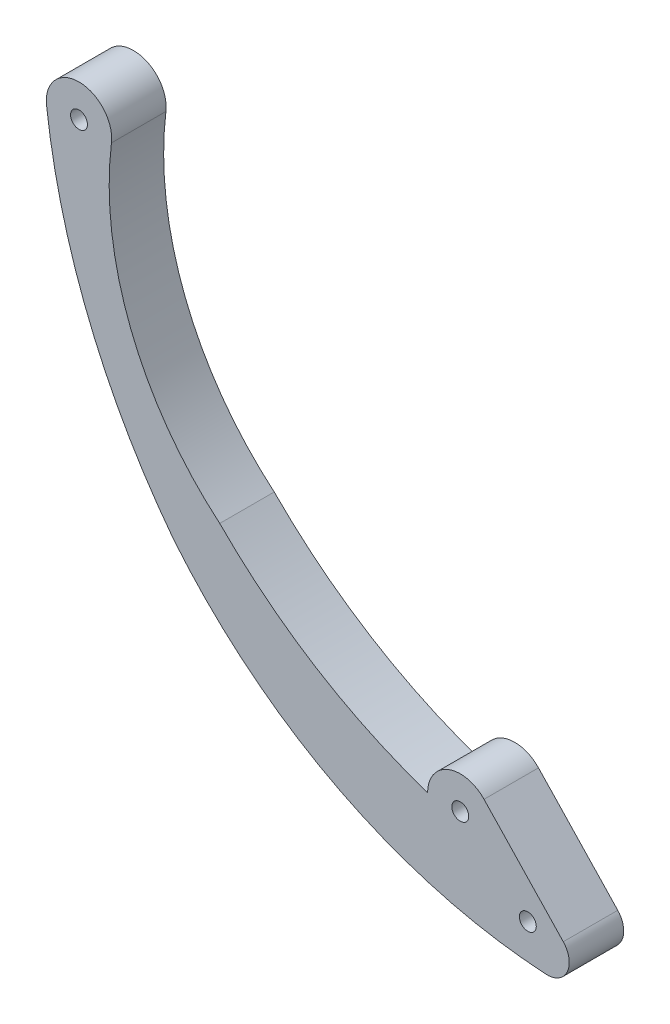
ISO-10303-21;
HEADER;
FILE_DESCRIPTION(('STEP AP214'),'2;1');
FILE_NAME('part.step','',(''),(''),'','','');
FILE_SCHEMA(('AUTOMOTIVE_DESIGN { 1 0 10303 214 1 1 1 1 }'));
ENDSEC;
DATA;
#1=APPLICATION_CONTEXT('core data for automotive mechanical design processes');
#2=APPLICATION_PROTOCOL_DEFINITION('international standard','automotive_design',2000,#1);
#3=PRODUCT_CONTEXT('',#1,'mechanical');
#4=PRODUCT('Part','Part','',(#3));
#5=PRODUCT_RELATED_PRODUCT_CATEGORY('part','',(#4));
#6=PRODUCT_DEFINITION_FORMATION('','',#4);
#7=PRODUCT_DEFINITION_CONTEXT('part definition',#1,'design');
#8=PRODUCT_DEFINITION('design','',#6,#7);
#9=PRODUCT_DEFINITION_SHAPE('','',#8);
#10=(LENGTH_UNIT() NAMED_UNIT(*) SI_UNIT(.MILLI.,.METRE.));
#11=(NAMED_UNIT(*) PLANE_ANGLE_UNIT() SI_UNIT($,.RADIAN.));
#12=(NAMED_UNIT(*) SI_UNIT($,.STERADIAN.) SOLID_ANGLE_UNIT());
#13=UNCERTAINTY_MEASURE_WITH_UNIT(LENGTH_MEASURE(1.E-05),#10,'distance_accuracy_value','');
#14=(GEOMETRIC_REPRESENTATION_CONTEXT(3) GLOBAL_UNCERTAINTY_ASSIGNED_CONTEXT((#13)) GLOBAL_UNIT_ASSIGNED_CONTEXT((#10,
#11,#12)) REPRESENTATION_CONTEXT('',''));
#15=CARTESIAN_POINT('',(0.,0.,0.));
#16=DIRECTION('',(0.,0.,1.));
#17=DIRECTION('',(1.,0.,0.));
#18=AXIS2_PLACEMENT_3D('',#15,#16,#17);
#19=CARTESIAN_POINT('',(0.,0.,5.));
#20=DIRECTION('',(0.,0.,1.));
#21=DIRECTION('',(1.,0.,0.));
#22=AXIS2_PLACEMENT_3D('',#19,#20,#21);
#23=PLANE('',#22);
#24=CARTESIAN_POINT('',(-16.,14.,5.));
#25=DIRECTION('',(0.,0.,1.));
#26=DIRECTION('',(1.,0.,0.));
#27=AXIS2_PLACEMENT_3D('',#24,#25,#26);
#28=CIRCLE('',#27,1.55);
#29=CARTESIAN_POINT('',(-14.45,14.,5.));
#30=VERTEX_POINT('',#29);
#31=EDGE_CURVE('E144',#30,#30,#28,.T.);
#32=ORIENTED_EDGE('',*,*,#31,.F.);
#33=EDGE_LOOP('',(#32));
#34=FACE_BOUND('',#33,.T.);
#35=CARTESIAN_POINT('',(0.,0.,5.));
#36=DIRECTION('',(0.,0.,1.));
#37=DIRECTION('',(1.,0.,0.));
#38=AXIS2_PLACEMENT_3D('',#35,#36,#37);
#39=CIRCLE('',#38,3.99999999999999);
#40=CARTESIAN_POINT('',(-0.232587208938574,-3.99323217334503,5.));
#41=VERTEX_POINT('',#40);
#42=CARTESIAN_POINT('',(2.90552342335605,2.74916962669263,5.));
#43=VERTEX_POINT('',#42);
#44=EDGE_CURVE('E150',#41,#43,#39,.T.);
#45=ORIENTED_EDGE('',*,*,#44,.T.);
#46=DIRECTION('',(-0.687292406673158,0.726380855839014,0.));
#47=VECTOR('',#46,1.);
#48=CARTESIAN_POINT('',(2.90552342335605,2.74916962669263,5.));
#49=LINE('',#48,#47);
#50=CARTESIAN_POINT('',(-11.6417148649659,18.123754440039,5.));
#51=VERTEX_POINT('',#50);
#52=EDGE_CURVE('E103',#43,#51,#49,.T.);
#53=ORIENTED_EDGE('',*,*,#52,.T.);
#54=CARTESIAN_POINT('',(-16.,14.,5.));
#55=DIRECTION('',(0.,0.,1.));
#56=DIRECTION('',(1.,0.,0.));
#57=AXIS2_PLACEMENT_3D('',#54,#55,#56);
#58=CIRCLE('',#57,6.);
#59=CARTESIAN_POINT('',(-22.,14.,5.));
#60=VERTEX_POINT('',#59);
#61=EDGE_CURVE('E153',#51,#60,#58,.T.);
#62=ORIENTED_EDGE('',*,*,#61,.T.);
#63=CARTESIAN_POINT('',(8.74913427491161,106.022299930331,5.));
#64=DIRECTION('',(0.,0.,-1.));
#65=DIRECTION('',(-1.,0.,0.));
#66=AXIS2_PLACEMENT_3D('',#63,#64,#65);
#67=CIRCLE('',#66,97.0237751436435);
#68=CARTESIAN_POINT('',(-60.1633996579984,37.7238694207662,5.));
#69=VERTEX_POINT('',#68);
#70=EDGE_CURVE('E155',#60,#69,#67,.T.);
#71=ORIENTED_EDGE('',*,*,#70,.T.);
#72=CARTESIAN_POINT('',(-23.3249717424258,81.396393712825,5.));
#73=DIRECTION('',(0.,0.,-1.));
#74=DIRECTION('',(1.,0.,0.));
#75=AXIS2_PLACEMENT_3D('',#72,#73,#74);
#76=CIRCLE('',#75,57.1345705272325);
#77=CARTESIAN_POINT('',(-80.0436726439243,88.2773905430564,5.));
#78=VERTEX_POINT('',#77);
#79=EDGE_CURVE('E157',#69,#78,#76,.T.);
#80=ORIENTED_EDGE('',*,*,#79,.T.);
#81=CARTESIAN_POINT('',(-86.,89.,5.));
#82=DIRECTION('',(0.,0.,1.));
#83=DIRECTION('',(1.,0.,0.));
#84=AXIS2_PLACEMENT_3D('',#81,#82,#83);
#85=CIRCLE('',#84,5.99999999999999);
#86=CARTESIAN_POINT('',(-91.9573603621302,88.2859569230645,5.));
#87=VERTEX_POINT('',#86);
#88=EDGE_CURVE('E159',#78,#87,#85,.T.);
#89=ORIENTED_EDGE('',*,*,#88,.T.);
#90=CARTESIAN_POINT('',(24.4862213513231,102.242764690578,5.));
#91=DIRECTION('',(0.,0.,1.));
#92=DIRECTION('',(1.,0.,0.));
#93=AXIS2_PLACEMENT_3D('',#90,#91,#92);
#94=CIRCLE('',#93,117.277023347785);
#95=CARTESIAN_POINT('',(-68.6302344446018,30.9460195662554,5.));
#96=VERTEX_POINT('',#95);
#97=EDGE_CURVE('E55',#87,#96,#94,.T.);
#98=ORIENTED_EDGE('',*,*,#97,.T.);
#99=CARTESIAN_POINT('',(5.31714943549073,91.2888214841465,5.));
#100=DIRECTION('',(0.,0.,1.));
#101=DIRECTION('',(-1.,0.,0.));
#102=AXIS2_PLACEMENT_3D('',#99,#100,#101);
#103=CIRCLE('',#102,95.4435399909895);
#104=EDGE_CURVE('E50',#96,#41,#103,.T.);
#105=ORIENTED_EDGE('',*,*,#104,.T.);
#106=EDGE_LOOP('',(#45,#53,#62,#71,#80,#89,#98,#105));
#107=FACE_BOUND('',#106,.T.);
#108=CARTESIAN_POINT('',(-86.,89.,5.));
#109=DIRECTION('',(0.,0.,1.));
#110=DIRECTION('',(1.,0.,0.));
#111=AXIS2_PLACEMENT_3D('',#108,#109,#110);
#112=CIRCLE('',#111,1.54999999999999);
#113=CARTESIAN_POINT('',(-84.45,89.,5.));
#114=VERTEX_POINT('',#113);
#115=EDGE_CURVE('E147',#114,#114,#112,.T.);
#116=ORIENTED_EDGE('',*,*,#115,.F.);
#117=EDGE_LOOP('',(#116));
#118=FACE_BOUND('',#117,.T.);
#119=CARTESIAN_POINT('',(-3.6022,2.7054,5.));
#120=DIRECTION('',(0.,0.,1.));
#121=DIRECTION('',(1.,0.,0.));
#122=AXIS2_PLACEMENT_3D('',#119,#120,#121);
#123=CIRCLE('',#122,1.55);
#124=CARTESIAN_POINT('',(-2.0522,2.7054,5.));
#125=VERTEX_POINT('',#124);
#126=EDGE_CURVE('E141',#125,#125,#123,.T.);
#127=ORIENTED_EDGE('',*,*,#126,.F.);
#128=EDGE_LOOP('',(#127));
#129=FACE_BOUND('',#128,.T.);
#130=ADVANCED_FACE('F35',(#34,#107,#118,#129),#23,.T.);
#131=CARTESIAN_POINT('',(0.,0.,5.));
#132=DIRECTION('',(0.,0.,-1.));
#133=DIRECTION('',(-1.,0.,0.));
#134=AXIS2_PLACEMENT_3D('',#131,#132,#133);
#135=CYLINDRICAL_SURFACE('',#134,3.99999999999999);
#136=DIRECTION('',(0.,0.,-1.));
#137=VECTOR('',#136,1.);
#138=CARTESIAN_POINT('',(-0.232587208938574,-3.99323217334503,5.));
#139=LINE('',#138,#137);
#140=CARTESIAN_POINT('',(-0.232587208938574,-3.99323217334503,-5.));
#141=VERTEX_POINT('',#140);
#142=EDGE_CURVE('E118',#41,#141,#139,.T.);
#143=ORIENTED_EDGE('',*,*,#142,.T.);
#144=CARTESIAN_POINT('',(0.,0.,-5.));
#145=DIRECTION('',(0.,0.,1.));
#146=DIRECTION('',(1.,0.,0.));
#147=AXIS2_PLACEMENT_3D('',#144,#145,#146);
#148=CIRCLE('',#147,3.99999999999999);
#149=CARTESIAN_POINT('',(2.90552342335605,2.74916962669263,-5.));
#150=VERTEX_POINT('',#149);
#151=EDGE_CURVE('E112',#141,#150,#148,.T.);
#152=ORIENTED_EDGE('',*,*,#151,.T.);
#153=DIRECTION('',(0.,0.,-1.));
#154=VECTOR('',#153,1.);
#155=CARTESIAN_POINT('',(2.90552342335605,2.74916962669263,5.));
#156=LINE('',#155,#154);
#157=EDGE_CURVE('E11',#43,#150,#156,.T.);
#158=ORIENTED_EDGE('',*,*,#157,.F.);
#159=ORIENTED_EDGE('',*,*,#44,.F.);
#160=EDGE_LOOP('',(#143,#152,#158,#159));
#161=FACE_BOUND('',#160,.T.);
#162=ADVANCED_FACE('F37',(#161),#135,.T.);
#163=CARTESIAN_POINT('',(2.90552342335605,2.74916962669263,5.));
#164=DIRECTION('',(-0.726380855839014,-0.687292406673158,0.));
#165=DIRECTION('',(0.687292406673158,-0.726380855839014,0.));
#166=AXIS2_PLACEMENT_3D('',#163,#164,#165);
#167=PLANE('',#166);
#168=ORIENTED_EDGE('',*,*,#157,.T.);
#169=DIRECTION('',(-0.687292406673158,0.726380855839014,0.));
#170=VECTOR('',#169,1.);
#171=CARTESIAN_POINT('',(2.90552342335605,2.74916962669263,-5.));
#172=LINE('',#171,#170);
#173=CARTESIAN_POINT('',(-11.6417148649659,18.123754440039,-5.));
#174=VERTEX_POINT('',#173);
#175=EDGE_CURVE('E102',#150,#174,#172,.T.);
#176=ORIENTED_EDGE('',*,*,#175,.T.);
#177=DIRECTION('',(0.,0.,-1.));
#178=VECTOR('',#177,1.);
#179=CARTESIAN_POINT('',(-11.6417148649659,18.123754440039,5.));
#180=LINE('',#179,#178);
#181=EDGE_CURVE('E43',#51,#174,#180,.T.);
#182=ORIENTED_EDGE('',*,*,#181,.F.);
#183=ORIENTED_EDGE('',*,*,#52,.F.);
#184=EDGE_LOOP('',(#168,#176,#182,#183));
#185=FACE_BOUND('',#184,.T.);
#186=ADVANCED_FACE('F100',(#185),#167,.F.);
#187=CARTESIAN_POINT('',(-16.,14.,5.));
#188=DIRECTION('',(0.,0.,-1.));
#189=DIRECTION('',(-1.,0.,0.));
#190=AXIS2_PLACEMENT_3D('',#187,#188,#189);
#191=CYLINDRICAL_SURFACE('',#190,6.);
#192=ORIENTED_EDGE('',*,*,#181,.T.);
#193=CARTESIAN_POINT('',(-16.,14.,-5.));
#194=DIRECTION('',(0.,0.,1.));
#195=DIRECTION('',(1.,0.,0.));
#196=AXIS2_PLACEMENT_3D('',#193,#194,#195);
#197=CIRCLE('',#196,6.);
#198=CARTESIAN_POINT('',(-22.,14.,-5.));
#199=VERTEX_POINT('',#198);
#200=EDGE_CURVE('E116',#174,#199,#197,.T.);
#201=ORIENTED_EDGE('',*,*,#200,.T.);
#202=DIRECTION('',(0.,0.,-1.));
#203=VECTOR('',#202,1.);
#204=CARTESIAN_POINT('',(-22.,14.,5.));
#205=LINE('',#204,#203);
#206=EDGE_CURVE('E172',#60,#199,#205,.T.);
#207=ORIENTED_EDGE('',*,*,#206,.F.);
#208=ORIENTED_EDGE('',*,*,#61,.F.);
#209=EDGE_LOOP('',(#192,#201,#207,#208));
#210=FACE_BOUND('',#209,.T.);
#211=ADVANCED_FACE('F175',(#210),#191,.T.);
#212=CARTESIAN_POINT('',(8.74913427491161,106.022299930331,5.));
#213=DIRECTION('',(0.,0.,-1.));
#214=DIRECTION('',(-1.,0.,0.));
#215=AXIS2_PLACEMENT_3D('',#212,#213,#214);
#216=CYLINDRICAL_SURFACE('',#215,97.0237751436435);
#217=ORIENTED_EDGE('',*,*,#206,.T.);
#218=CARTESIAN_POINT('',(8.74913427491161,106.022299930331,-5.));
#219=DIRECTION('',(0.,0.,-1.));
#220=DIRECTION('',(-1.,0.,0.));
#221=AXIS2_PLACEMENT_3D('',#218,#219,#220);
#222=CIRCLE('',#221,97.0237751436435);
#223=CARTESIAN_POINT('',(-60.1633996579984,37.7238694207662,-5.));
#224=VERTEX_POINT('',#223);
#225=EDGE_CURVE('E127',#199,#224,#222,.T.);
#226=ORIENTED_EDGE('',*,*,#225,.T.);
#227=DIRECTION('',(0.,0.,-1.));
#228=VECTOR('',#227,1.);
#229=CARTESIAN_POINT('',(-60.1633996579984,37.7238694207662,5.));
#230=LINE('',#229,#228);
#231=EDGE_CURVE('E170',#69,#224,#230,.T.);
#232=ORIENTED_EDGE('',*,*,#231,.F.);
#233=ORIENTED_EDGE('',*,*,#70,.F.);
#234=EDGE_LOOP('',(#217,#226,#232,#233));
#235=FACE_BOUND('',#234,.T.);
#236=ADVANCED_FACE('F183',(#235),#216,.F.);
#237=CARTESIAN_POINT('',(-23.3249717424258,81.396393712825,5.));
#238=DIRECTION('',(0.,0.,-1.));
#239=DIRECTION('',(-1.,0.,0.));
#240=AXIS2_PLACEMENT_3D('',#237,#238,#239);
#241=CYLINDRICAL_SURFACE('',#240,57.1345705272325);
#242=ORIENTED_EDGE('',*,*,#231,.T.);
#243=CARTESIAN_POINT('',(-23.3249717424258,81.396393712825,-5.));
#244=DIRECTION('',(0.,0.,-1.));
#245=DIRECTION('',(1.,0.,0.));
#246=AXIS2_PLACEMENT_3D('',#243,#244,#245);
#247=CIRCLE('',#246,57.1345705272325);
#248=CARTESIAN_POINT('',(-80.0436726439243,88.2773905430564,-5.));
#249=VERTEX_POINT('',#248);
#250=EDGE_CURVE('E130',#224,#249,#247,.T.);
#251=ORIENTED_EDGE('',*,*,#250,.T.);
#252=DIRECTION('',(0.,0.,-1.));
#253=VECTOR('',#252,1.);
#254=CARTESIAN_POINT('',(-80.0436726439243,88.2773905430564,5.));
#255=LINE('',#254,#253);
#256=EDGE_CURVE('E168',#78,#249,#255,.T.);
#257=ORIENTED_EDGE('',*,*,#256,.F.);
#258=ORIENTED_EDGE('',*,*,#79,.F.);
#259=EDGE_LOOP('',(#242,#251,#257,#258));
#260=FACE_BOUND('',#259,.T.);
#261=ADVANCED_FACE('F186',(#260),#241,.F.);
#262=CARTESIAN_POINT('',(-86.,89.,5.));
#263=DIRECTION('',(0.,0.,-1.));
#264=DIRECTION('',(-1.,0.,0.));
#265=AXIS2_PLACEMENT_3D('',#262,#263,#264);
#266=CYLINDRICAL_SURFACE('',#265,5.99999999999999);
#267=ORIENTED_EDGE('',*,*,#256,.T.);
#268=CARTESIAN_POINT('',(-86.,89.,-5.));
#269=DIRECTION('',(0.,0.,1.));
#270=DIRECTION('',(1.,0.,0.));
#271=AXIS2_PLACEMENT_3D('',#268,#269,#270);
#272=CIRCLE('',#271,5.99999999999999);
#273=CARTESIAN_POINT('',(-91.9573603621302,88.2859569230645,-5.));
#274=VERTEX_POINT('',#273);
#275=EDGE_CURVE('E133',#249,#274,#272,.T.);
#276=ORIENTED_EDGE('',*,*,#275,.T.);
#277=DIRECTION('',(0.,0.,-1.));
#278=VECTOR('',#277,1.);
#279=CARTESIAN_POINT('',(-91.9573603621302,88.2859569230645,5.));
#280=LINE('',#279,#278);
#281=EDGE_CURVE('E166',#87,#274,#280,.T.);
#282=ORIENTED_EDGE('',*,*,#281,.F.);
#283=ORIENTED_EDGE('',*,*,#88,.F.);
#284=EDGE_LOOP('',(#267,#276,#282,#283));
#285=FACE_BOUND('',#284,.T.);
#286=ADVANCED_FACE('F191',(#285),#266,.T.);
#287=CARTESIAN_POINT('',(24.4862213513231,102.242764690578,5.));
#288=DIRECTION('',(0.,0.,-1.));
#289=DIRECTION('',(-1.,0.,0.));
#290=AXIS2_PLACEMENT_3D('',#287,#288,#289);
#291=CYLINDRICAL_SURFACE('',#290,117.277023347785);
#292=ORIENTED_EDGE('',*,*,#281,.T.);
#293=CARTESIAN_POINT('',(24.4862213513231,102.242764690578,-5.));
#294=DIRECTION('',(0.,0.,1.));
#295=DIRECTION('',(1.,0.,0.));
#296=AXIS2_PLACEMENT_3D('',#293,#294,#295);
#297=CIRCLE('',#296,117.277023347785);
#298=CARTESIAN_POINT('',(-68.6302344446018,30.9460195662554,-5.));
#299=VERTEX_POINT('',#298);
#300=EDGE_CURVE('E136',#274,#299,#297,.T.);
#301=ORIENTED_EDGE('',*,*,#300,.T.);
#302=DIRECTION('',(0.,0.,-1.));
#303=VECTOR('',#302,1.);
#304=CARTESIAN_POINT('',(-68.6302344446018,30.9460195662554,5.));
#305=LINE('',#304,#303);
#306=EDGE_CURVE('E164',#96,#299,#305,.T.);
#307=ORIENTED_EDGE('',*,*,#306,.F.);
#308=ORIENTED_EDGE('',*,*,#97,.F.);
#309=EDGE_LOOP('',(#292,#301,#307,#308));
#310=FACE_BOUND('',#309,.T.);
#311=ADVANCED_FACE('F194',(#310),#291,.T.);
#312=CARTESIAN_POINT('',(5.31714943549073,91.2888214841465,5.));
#313=DIRECTION('',(0.,0.,-1.));
#314=DIRECTION('',(-1.,0.,0.));
#315=AXIS2_PLACEMENT_3D('',#312,#313,#314);
#316=CYLINDRICAL_SURFACE('',#315,95.4435399909895);
#317=ORIENTED_EDGE('',*,*,#306,.T.);
#318=CARTESIAN_POINT('',(5.31714943549073,91.2888214841465,-5.));
#319=DIRECTION('',(0.,0.,1.));
#320=DIRECTION('',(-1.,0.,0.));
#321=AXIS2_PLACEMENT_3D('',#318,#319,#320);
#322=CIRCLE('',#321,95.4435399909895);
#323=EDGE_CURVE('E139',#299,#141,#322,.T.);
#324=ORIENTED_EDGE('',*,*,#323,.T.);
#325=ORIENTED_EDGE('',*,*,#142,.F.);
#326=ORIENTED_EDGE('',*,*,#104,.F.);
#327=EDGE_LOOP('',(#317,#324,#325,#326));
#328=FACE_BOUND('',#327,.T.);
#329=ADVANCED_FACE('F196',(#328),#316,.T.);
#330=CARTESIAN_POINT('',(-86.,89.,5.));
#331=DIRECTION('',(0.,0.,-1.));
#332=DIRECTION('',(-1.,0.,0.));
#333=AXIS2_PLACEMENT_3D('',#330,#331,#332);
#334=CYLINDRICAL_SURFACE('',#333,1.54999999999999);
#335=ORIENTED_EDGE('',*,*,#115,.T.);
#336=EDGE_LOOP('',(#335));
#337=FACE_BOUND('',#336,.T.);
#338=CARTESIAN_POINT('',(-86.,89.,-5.));
#339=DIRECTION('',(0.,0.,1.));
#340=DIRECTION('',(1.,0.,0.));
#341=AXIS2_PLACEMENT_3D('',#338,#339,#340);
#342=CIRCLE('',#341,1.54999999999999);
#343=CARTESIAN_POINT('',(-84.45,89.,-5.));
#344=VERTEX_POINT('',#343);
#345=EDGE_CURVE('E119',#344,#344,#342,.T.);
#346=ORIENTED_EDGE('',*,*,#345,.F.);
#347=EDGE_LOOP('',(#346));
#348=FACE_BOUND('',#347,.T.);
#349=ADVANCED_FACE('F198',(#337,#348),#334,.F.);
#350=CARTESIAN_POINT('',(-16.,14.,5.));
#351=DIRECTION('',(0.,0.,-1.));
#352=DIRECTION('',(-1.,0.,0.));
#353=AXIS2_PLACEMENT_3D('',#350,#351,#352);
#354=CYLINDRICAL_SURFACE('',#353,1.55);
#355=ORIENTED_EDGE('',*,*,#31,.T.);
#356=EDGE_LOOP('',(#355));
#357=FACE_BOUND('',#356,.T.);
#358=CARTESIAN_POINT('',(-16.,14.,-5.));
#359=DIRECTION('',(0.,0.,1.));
#360=DIRECTION('',(1.,0.,0.));
#361=AXIS2_PLACEMENT_3D('',#358,#359,#360);
#362=CIRCLE('',#361,1.55);
#363=CARTESIAN_POINT('',(-14.45,14.,-5.));
#364=VERTEX_POINT('',#363);
#365=EDGE_CURVE('E122',#364,#364,#362,.T.);
#366=ORIENTED_EDGE('',*,*,#365,.F.);
#367=EDGE_LOOP('',(#366));
#368=FACE_BOUND('',#367,.T.);
#369=ADVANCED_FACE('F204',(#357,#368),#354,.F.);
#370=CARTESIAN_POINT('',(-3.6022,2.7054,5.));
#371=DIRECTION('',(0.,0.,-1.));
#372=DIRECTION('',(-1.,0.,0.));
#373=AXIS2_PLACEMENT_3D('',#370,#371,#372);
#374=CYLINDRICAL_SURFACE('',#373,1.55);
#375=ORIENTED_EDGE('',*,*,#126,.T.);
#376=EDGE_LOOP('',(#375));
#377=FACE_BOUND('',#376,.T.);
#378=CARTESIAN_POINT('',(-3.6022,2.7054,-5.));
#379=DIRECTION('',(0.,0.,1.));
#380=DIRECTION('',(1.,0.,0.));
#381=AXIS2_PLACEMENT_3D('',#378,#379,#380);
#382=CIRCLE('',#381,1.55);
#383=CARTESIAN_POINT('',(-2.0522,2.7054,-5.));
#384=VERTEX_POINT('',#383);
#385=EDGE_CURVE('E230',#384,#384,#382,.T.);
#386=ORIENTED_EDGE('',*,*,#385,.F.);
#387=EDGE_LOOP('',(#386));
#388=FACE_BOUND('',#387,.T.);
#389=ADVANCED_FACE('F218',(#377,#388),#374,.F.);
#390=CARTESIAN_POINT('',(0.,0.,-5.));
#391=DIRECTION('',(0.,0.,1.));
#392=DIRECTION('',(1.,0.,0.));
#393=AXIS2_PLACEMENT_3D('',#390,#391,#392);
#394=PLANE('',#393);
#395=ORIENTED_EDGE('',*,*,#385,.T.);
#396=EDGE_LOOP('',(#395));
#397=FACE_BOUND('',#396,.T.);
#398=ORIENTED_EDGE('',*,*,#365,.T.);
#399=EDGE_LOOP('',(#398));
#400=FACE_BOUND('',#399,.T.);
#401=ORIENTED_EDGE('',*,*,#345,.T.);
#402=EDGE_LOOP('',(#401));
#403=FACE_BOUND('',#402,.T.);
#404=ORIENTED_EDGE('',*,*,#151,.F.);
#405=ORIENTED_EDGE('',*,*,#323,.F.);
#406=ORIENTED_EDGE('',*,*,#300,.F.);
#407=ORIENTED_EDGE('',*,*,#275,.F.);
#408=ORIENTED_EDGE('',*,*,#250,.F.);
#409=ORIENTED_EDGE('',*,*,#225,.F.);
#410=ORIENTED_EDGE('',*,*,#200,.F.);
#411=ORIENTED_EDGE('',*,*,#175,.F.);
#412=EDGE_LOOP('',(#404,#405,#406,#407,#408,#409,#410,#411));
#413=FACE_BOUND('',#412,.T.);
#414=ADVANCED_FACE('F110',(#397,#400,#403,#413),#394,.F.);
#415=CLOSED_SHELL('',(#130,#162,#186,#211,#236,#261,#286,#311,#329,#349,#369,#389,#414));
#416=MANIFOLD_SOLID_BREP('B2',#415);
#417=ADVANCED_BREP_SHAPE_REPRESENTATION('',(#18,#416),#14);
#418=SHAPE_DEFINITION_REPRESENTATION(#9,#417);
ENDSEC;
END-ISO-10303-21;
